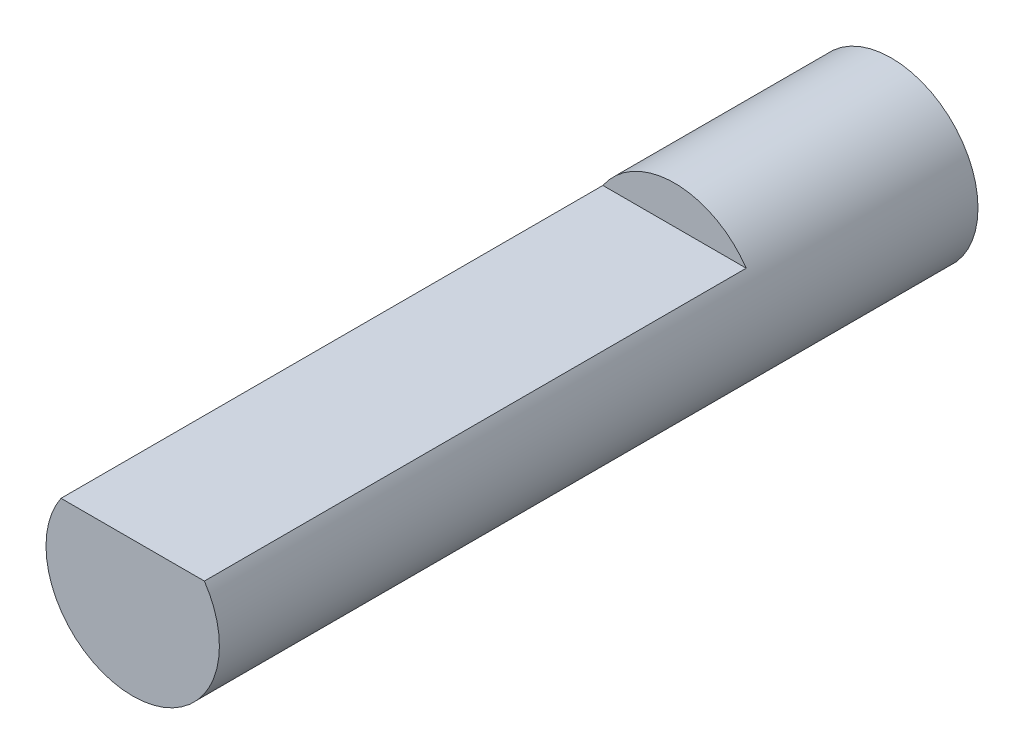
ISO-10303-21;
HEADER;
FILE_DESCRIPTION(('STEP AP214'),'2;1');
FILE_NAME('part.step','',(''),(''),'','','');
FILE_SCHEMA(('AUTOMOTIVE_DESIGN { 1 0 10303 214 1 1 1 1 }'));
ENDSEC;
DATA;
#1=APPLICATION_CONTEXT('core data for automotive mechanical design processes');
#2=APPLICATION_PROTOCOL_DEFINITION('international standard','automotive_design',2000,#1);
#3=PRODUCT_CONTEXT('',#1,'mechanical');
#4=PRODUCT('Part','Part','',(#3));
#5=PRODUCT_RELATED_PRODUCT_CATEGORY('part','',(#4));
#6=PRODUCT_DEFINITION_FORMATION('','',#4);
#7=PRODUCT_DEFINITION_CONTEXT('part definition',#1,'design');
#8=PRODUCT_DEFINITION('design','',#6,#7);
#9=PRODUCT_DEFINITION_SHAPE('','',#8);
#10=(LENGTH_UNIT() NAMED_UNIT(*) SI_UNIT(.MILLI.,.METRE.));
#11=(NAMED_UNIT(*) PLANE_ANGLE_UNIT() SI_UNIT($,.RADIAN.));
#12=(NAMED_UNIT(*) SI_UNIT($,.STERADIAN.) SOLID_ANGLE_UNIT());
#13=UNCERTAINTY_MEASURE_WITH_UNIT(LENGTH_MEASURE(1.E-05),#10,'distance_accuracy_value','');
#14=(GEOMETRIC_REPRESENTATION_CONTEXT(3) GLOBAL_UNCERTAINTY_ASSIGNED_CONTEXT((#13)) GLOBAL_UNIT_ASSIGNED_CONTEXT((#10,
#11,#12)) REPRESENTATION_CONTEXT('',''));
#15=CARTESIAN_POINT('',(0.,0.,0.));
#16=DIRECTION('',(0.,0.,1.));
#17=DIRECTION('',(1.,0.,0.));
#18=AXIS2_PLACEMENT_3D('',#15,#16,#17);
#19=CARTESIAN_POINT('',(0.,0.,14.));
#20=DIRECTION('',(0.,0.,-1.));
#21=DIRECTION('',(-1.,0.,0.));
#22=AXIS2_PLACEMENT_3D('',#19,#20,#21);
#23=CYLINDRICAL_SURFACE('',#22,1.6);
#24=CARTESIAN_POINT('',(0.,0.,14.));
#25=DIRECTION('',(0.,0.,1.));
#26=DIRECTION('',(1.,0.,0.));
#27=AXIS2_PLACEMENT_3D('',#24,#25,#26);
#28=CIRCLE('',#27,1.6);
#29=CARTESIAN_POINT('',(-1.3228756555323,0.9,14.));
#30=VERTEX_POINT('',#29);
#31=CARTESIAN_POINT('',(1.3228756555323,0.9,14.));
#32=VERTEX_POINT('',#31);
#33=EDGE_CURVE('E11',#30,#32,#28,.T.);
#34=ORIENTED_EDGE('',*,*,#33,.F.);
#35=DIRECTION('',(0.,0.,1.));
#36=VECTOR('',#35,1.);
#37=CARTESIAN_POINT('',(-1.3228756555323,0.9,4.));
#38=LINE('',#37,#36);
#39=CARTESIAN_POINT('',(-1.3228756555323,0.9,4.));
#40=VERTEX_POINT('',#39);
#41=EDGE_CURVE('E46',#40,#30,#38,.T.);
#42=ORIENTED_EDGE('',*,*,#41,.F.);
#43=CARTESIAN_POINT('',(0.,0.,4.));
#44=DIRECTION('',(0.,0.,1.));
#45=DIRECTION('',(1.,0.,0.));
#46=AXIS2_PLACEMENT_3D('',#43,#44,#45);
#47=CIRCLE('',#46,1.6);
#48=CARTESIAN_POINT('',(1.3228756555323,0.9,4.));
#49=VERTEX_POINT('',#48);
#50=EDGE_CURVE('E61',#49,#40,#47,.T.);
#51=ORIENTED_EDGE('',*,*,#50,.F.);
#52=DIRECTION('',(0.,0.,1.));
#53=VECTOR('',#52,1.);
#54=CARTESIAN_POINT('',(1.3228756555323,0.9,4.));
#55=LINE('',#54,#53);
#56=EDGE_CURVE('E52',#49,#32,#55,.T.);
#57=ORIENTED_EDGE('',*,*,#56,.T.);
#58=EDGE_LOOP('',(#34,#42,#51,#57));
#59=FACE_BOUND('',#58,.T.);
#60=CARTESIAN_POINT('',(0.,0.,0.));
#61=DIRECTION('',(0.,0.,1.));
#62=DIRECTION('',(1.,0.,0.));
#63=AXIS2_PLACEMENT_3D('',#60,#61,#62);
#64=CIRCLE('',#63,1.6);
#65=CARTESIAN_POINT('',(1.6,0.,0.));
#66=VERTEX_POINT('',#65);
#67=EDGE_CURVE('E35',#66,#66,#64,.T.);
#68=ORIENTED_EDGE('',*,*,#67,.T.);
#69=EDGE_LOOP('',(#68));
#70=FACE_BOUND('',#69,.T.);
#71=ADVANCED_FACE('F32',(#59,#70),#23,.T.);
#72=CARTESIAN_POINT('',(0.,0.,14.));
#73=DIRECTION('',(0.,0.,1.));
#74=DIRECTION('',(1.,0.,0.));
#75=AXIS2_PLACEMENT_3D('',#72,#73,#74);
#76=PLANE('',#75);
#77=DIRECTION('',(1.,0.,0.));
#78=VECTOR('',#77,1.);
#79=CARTESIAN_POINT('',(0.,0.9,14.));
#80=LINE('',#79,#78);
#81=EDGE_CURVE('E57',#30,#32,#80,.T.);
#82=ORIENTED_EDGE('',*,*,#81,.F.);
#83=ORIENTED_EDGE('',*,*,#33,.T.);
#84=EDGE_LOOP('',(#82,#83));
#85=FACE_BOUND('',#84,.T.);
#86=ADVANCED_FACE('F67',(#85),#76,.T.);
#87=CARTESIAN_POINT('',(0.,0.,0.));
#88=DIRECTION('',(0.,0.,1.));
#89=DIRECTION('',(1.,0.,0.));
#90=AXIS2_PLACEMENT_3D('',#87,#88,#89);
#91=PLANE('',#90);
#92=ORIENTED_EDGE('',*,*,#67,.F.);
#93=EDGE_LOOP('',(#92));
#94=FACE_BOUND('',#93,.T.);
#95=ADVANCED_FACE('F69',(#94),#91,.F.);
#96=CARTESIAN_POINT('',(0.,0.9,4.));
#97=DIRECTION('',(0.,-1.,0.));
#98=DIRECTION('',(0.,0.,-1.));
#99=AXIS2_PLACEMENT_3D('',#96,#97,#98);
#100=PLANE('',#99);
#101=ORIENTED_EDGE('',*,*,#81,.T.);
#102=ORIENTED_EDGE('',*,*,#56,.F.);
#103=DIRECTION('',(1.,0.,0.));
#104=VECTOR('',#103,1.);
#105=CARTESIAN_POINT('',(0.,0.9,4.));
#106=LINE('',#105,#104);
#107=EDGE_CURVE('E84',#40,#49,#106,.T.);
#108=ORIENTED_EDGE('',*,*,#107,.F.);
#109=ORIENTED_EDGE('',*,*,#41,.T.);
#110=EDGE_LOOP('',(#101,#102,#108,#109));
#111=FACE_BOUND('',#110,.T.);
#112=ADVANCED_FACE('F58',(#111),#100,.F.);
#113=CARTESIAN_POINT('',(0.,0.,4.));
#114=DIRECTION('',(0.,0.,1.));
#115=DIRECTION('',(1.,0.,0.));
#116=AXIS2_PLACEMENT_3D('',#113,#114,#115);
#117=PLANE('',#116);
#118=ORIENTED_EDGE('',*,*,#50,.T.);
#119=ORIENTED_EDGE('',*,*,#107,.T.);
#120=EDGE_LOOP('',(#118,#119));
#121=FACE_BOUND('',#120,.T.);
#122=ADVANCED_FACE('F79',(#121),#117,.T.);
#123=CLOSED_SHELL('',(#71,#86,#95,#112,#122));
#124=MANIFOLD_SOLID_BREP('B2',#123);
#125=ADVANCED_BREP_SHAPE_REPRESENTATION('',(#18,#124),#14);
#126=SHAPE_DEFINITION_REPRESENTATION(#9,#125);
ENDSEC;
END-ISO-10303-21;
